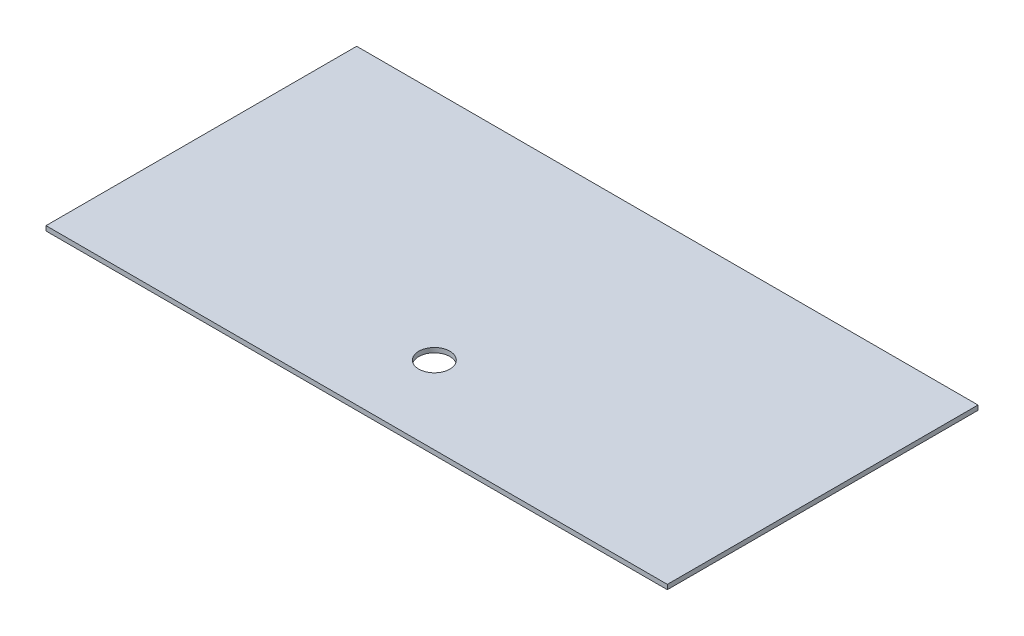
ISO-10303-21;
HEADER;
FILE_DESCRIPTION(('STEP AP214'),'2;1');
FILE_NAME('part.step','',(''),(''),'','','');
FILE_SCHEMA(('AUTOMOTIVE_DESIGN { 1 0 10303 214 1 1 1 1 }'));
ENDSEC;
DATA;
#1=APPLICATION_CONTEXT('core data for automotive mechanical design processes');
#2=APPLICATION_PROTOCOL_DEFINITION('international standard','automotive_design',2000,#1);
#3=PRODUCT_CONTEXT('',#1,'mechanical');
#4=PRODUCT('Part','Part','',(#3));
#5=PRODUCT_RELATED_PRODUCT_CATEGORY('part','',(#4));
#6=PRODUCT_DEFINITION_FORMATION('','',#4);
#7=PRODUCT_DEFINITION_CONTEXT('part definition',#1,'design');
#8=PRODUCT_DEFINITION('design','',#6,#7);
#9=PRODUCT_DEFINITION_SHAPE('','',#8);
#10=(LENGTH_UNIT() NAMED_UNIT(*) SI_UNIT(.MILLI.,.METRE.));
#11=(NAMED_UNIT(*) PLANE_ANGLE_UNIT() SI_UNIT($,.RADIAN.));
#12=(NAMED_UNIT(*) SI_UNIT($,.STERADIAN.) SOLID_ANGLE_UNIT());
#13=UNCERTAINTY_MEASURE_WITH_UNIT(LENGTH_MEASURE(1.E-05),#10,'distance_accuracy_value','');
#14=(GEOMETRIC_REPRESENTATION_CONTEXT(3) GLOBAL_UNCERTAINTY_ASSIGNED_CONTEXT((#13)) GLOBAL_UNIT_ASSIGNED_CONTEXT((#10,
#11,#12)) REPRESENTATION_CONTEXT('',''));
#15=CARTESIAN_POINT('',(0.,0.,0.));
#16=DIRECTION('',(0.,0.,1.));
#17=DIRECTION('',(1.,0.,0.));
#18=AXIS2_PLACEMENT_3D('',#15,#16,#17);
#19=CARTESIAN_POINT('',(0.,18.,0.));
#20=DIRECTION('',(0.,-1.,0.));
#21=DIRECTION('',(0.,0.,-1.));
#22=AXIS2_PLACEMENT_3D('',#19,#20,#21);
#23=PLANE('',#22);
#24=DIRECTION('',(0.,0.,-1.));
#25=VECTOR('',#24,1.);
#26=CARTESIAN_POINT('',(1200.,18.,600.));
#27=LINE('',#26,#25);
#28=CARTESIAN_POINT('',(1200.,18.,600.));
#29=VERTEX_POINT('',#28);
#30=CARTESIAN_POINT('',(1200.,18.,-600.));
#31=VERTEX_POINT('',#30);
#32=EDGE_CURVE('E91',#29,#31,#27,.T.);
#33=ORIENTED_EDGE('',*,*,#32,.T.);
#34=DIRECTION('',(-1.,0.,0.));
#35=VECTOR('',#34,1.);
#36=CARTESIAN_POINT('',(-1200.,18.,-600.));
#37=LINE('',#36,#35);
#38=CARTESIAN_POINT('',(-1200.,18.,-600.));
#39=VERTEX_POINT('',#38);
#40=EDGE_CURVE('E86',#31,#39,#37,.T.);
#41=ORIENTED_EDGE('',*,*,#40,.T.);
#42=DIRECTION('',(0.,0.,1.));
#43=VECTOR('',#42,1.);
#44=CARTESIAN_POINT('',(-1200.,18.,600.));
#45=LINE('',#44,#43);
#46=CARTESIAN_POINT('',(-1200.,18.,600.));
#47=VERTEX_POINT('',#46);
#48=EDGE_CURVE('E89',#39,#47,#45,.T.);
#49=ORIENTED_EDGE('',*,*,#48,.T.);
#50=DIRECTION('',(1.,0.,0.));
#51=VECTOR('',#50,1.);
#52=CARTESIAN_POINT('',(-1200.,18.,600.));
#53=LINE('',#52,#51);
#54=EDGE_CURVE('E56',#47,#29,#53,.T.);
#55=ORIENTED_EDGE('',*,*,#54,.T.);
#56=EDGE_LOOP('',(#33,#41,#49,#55));
#57=FACE_BOUND('',#56,.T.);
#58=CARTESIAN_POINT('',(0.,18.,300.));
#59=DIRECTION('',(0.,1.,0.));
#60=DIRECTION('',(0.,0.,1.));
#61=AXIS2_PLACEMENT_3D('',#58,#59,#60);
#62=CIRCLE('',#61,60.);
#63=CARTESIAN_POINT('',(0.,18.,360.));
#64=VERTEX_POINT('',#63);
#65=EDGE_CURVE('E106',#64,#64,#62,.T.);
#66=ORIENTED_EDGE('',*,*,#65,.F.);
#67=EDGE_LOOP('',(#66));
#68=FACE_BOUND('',#67,.T.);
#69=ADVANCED_FACE('F39',(#57,#68),#23,.F.);
#70=CARTESIAN_POINT('',(0.,0.,0.));
#71=DIRECTION('',(0.,-1.,0.));
#72=DIRECTION('',(0.,0.,-1.));
#73=AXIS2_PLACEMENT_3D('',#70,#71,#72);
#74=PLANE('',#73);
#75=DIRECTION('',(0.,0.,-1.));
#76=VECTOR('',#75,1.);
#77=CARTESIAN_POINT('',(1200.,0.,600.));
#78=LINE('',#77,#76);
#79=CARTESIAN_POINT('',(1200.,0.,600.));
#80=VERTEX_POINT('',#79);
#81=CARTESIAN_POINT('',(1200.,0.,-600.));
#82=VERTEX_POINT('',#81);
#83=EDGE_CURVE('E103',#80,#82,#78,.T.);
#84=ORIENTED_EDGE('',*,*,#83,.F.);
#85=DIRECTION('',(1.,0.,0.));
#86=VECTOR('',#85,1.);
#87=CARTESIAN_POINT('',(-1200.,0.,600.));
#88=LINE('',#87,#86);
#89=CARTESIAN_POINT('',(-1200.,0.,600.));
#90=VERTEX_POINT('',#89);
#91=EDGE_CURVE('E79',#90,#80,#88,.T.);
#92=ORIENTED_EDGE('',*,*,#91,.F.);
#93=DIRECTION('',(0.,0.,1.));
#94=VECTOR('',#93,1.);
#95=CARTESIAN_POINT('',(-1200.,0.,600.));
#96=LINE('',#95,#94);
#97=CARTESIAN_POINT('',(-1200.,0.,-600.));
#98=VERTEX_POINT('',#97);
#99=EDGE_CURVE('E73',#98,#90,#96,.T.);
#100=ORIENTED_EDGE('',*,*,#99,.F.);
#101=DIRECTION('',(-1.,0.,0.));
#102=VECTOR('',#101,1.);
#103=CARTESIAN_POINT('',(-1200.,0.,-600.));
#104=LINE('',#103,#102);
#105=EDGE_CURVE('E95',#82,#98,#104,.T.);
#106=ORIENTED_EDGE('',*,*,#105,.F.);
#107=EDGE_LOOP('',(#84,#92,#100,#106));
#108=FACE_BOUND('',#107,.T.);
#109=CARTESIAN_POINT('',(0.,0.,300.));
#110=DIRECTION('',(0.,1.,0.));
#111=DIRECTION('',(0.,0.,1.));
#112=AXIS2_PLACEMENT_3D('',#109,#110,#111);
#113=CIRCLE('',#112,60.);
#114=CARTESIAN_POINT('',(0.,0.,360.));
#115=VERTEX_POINT('',#114);
#116=EDGE_CURVE('E118',#115,#115,#113,.T.);
#117=ORIENTED_EDGE('',*,*,#116,.T.);
#118=EDGE_LOOP('',(#117));
#119=FACE_BOUND('',#118,.T.);
#120=ADVANCED_FACE('F114',(#108,#119),#74,.T.);
#121=CARTESIAN_POINT('',(1200.,18.,600.));
#122=DIRECTION('',(-1.,0.,0.));
#123=DIRECTION('',(0.,0.,1.));
#124=AXIS2_PLACEMENT_3D('',#121,#122,#123);
#125=PLANE('',#124);
#126=ORIENTED_EDGE('',*,*,#83,.T.);
#127=DIRECTION('',(0.,-1.,0.));
#128=VECTOR('',#127,1.);
#129=CARTESIAN_POINT('',(1200.,18.,-600.));
#130=LINE('',#129,#128);
#131=EDGE_CURVE('E11',#31,#82,#130,.T.);
#132=ORIENTED_EDGE('',*,*,#131,.F.);
#133=ORIENTED_EDGE('',*,*,#32,.F.);
#134=DIRECTION('',(0.,-1.,0.));
#135=VECTOR('',#134,1.);
#136=CARTESIAN_POINT('',(1200.,18.,600.));
#137=LINE('',#136,#135);
#138=EDGE_CURVE('E99',#29,#80,#137,.T.);
#139=ORIENTED_EDGE('',*,*,#138,.T.);
#140=EDGE_LOOP('',(#126,#132,#133,#139));
#141=FACE_BOUND('',#140,.T.);
#142=ADVANCED_FACE('F41',(#141),#125,.F.);
#143=CARTESIAN_POINT('',(-1200.,18.,-600.));
#144=DIRECTION('',(0.,0.,1.));
#145=DIRECTION('',(1.,0.,0.));
#146=AXIS2_PLACEMENT_3D('',#143,#144,#145);
#147=PLANE('',#146);
#148=ORIENTED_EDGE('',*,*,#105,.T.);
#149=DIRECTION('',(0.,-1.,0.));
#150=VECTOR('',#149,1.);
#151=CARTESIAN_POINT('',(-1200.,18.,-600.));
#152=LINE('',#151,#150);
#153=EDGE_CURVE('E48',#39,#98,#152,.T.);
#154=ORIENTED_EDGE('',*,*,#153,.F.);
#155=ORIENTED_EDGE('',*,*,#40,.F.);
#156=ORIENTED_EDGE('',*,*,#131,.T.);
#157=EDGE_LOOP('',(#148,#154,#155,#156));
#158=FACE_BOUND('',#157,.T.);
#159=ADVANCED_FACE('F94',(#158),#147,.F.);
#160=CARTESIAN_POINT('',(-1200.,18.,600.));
#161=DIRECTION('',(1.,0.,0.));
#162=DIRECTION('',(0.,0.,-1.));
#163=AXIS2_PLACEMENT_3D('',#160,#161,#162);
#164=PLANE('',#163);
#165=ORIENTED_EDGE('',*,*,#99,.T.);
#166=DIRECTION('',(0.,-1.,0.));
#167=VECTOR('',#166,1.);
#168=CARTESIAN_POINT('',(-1200.,18.,600.));
#169=LINE('',#168,#167);
#170=EDGE_CURVE('E96',#47,#90,#169,.T.);
#171=ORIENTED_EDGE('',*,*,#170,.F.);
#172=ORIENTED_EDGE('',*,*,#48,.F.);
#173=ORIENTED_EDGE('',*,*,#153,.T.);
#174=EDGE_LOOP('',(#165,#171,#172,#173));
#175=FACE_BOUND('',#174,.T.);
#176=ADVANCED_FACE('F97',(#175),#164,.F.);
#177=CARTESIAN_POINT('',(-1200.,18.,600.));
#178=DIRECTION('',(0.,0.,-1.));
#179=DIRECTION('',(-1.,0.,0.));
#180=AXIS2_PLACEMENT_3D('',#177,#178,#179);
#181=PLANE('',#180);
#182=ORIENTED_EDGE('',*,*,#91,.T.);
#183=ORIENTED_EDGE('',*,*,#138,.F.);
#184=ORIENTED_EDGE('',*,*,#54,.F.);
#185=ORIENTED_EDGE('',*,*,#170,.T.);
#186=EDGE_LOOP('',(#182,#183,#184,#185));
#187=FACE_BOUND('',#186,.T.);
#188=ADVANCED_FACE('F111',(#187),#181,.F.);
#189=CARTESIAN_POINT('',(0.,18.,300.));
#190=DIRECTION('',(0.,-1.,0.));
#191=DIRECTION('',(0.,0.,-1.));
#192=AXIS2_PLACEMENT_3D('',#189,#190,#191);
#193=CYLINDRICAL_SURFACE('',#192,60.);
#194=ORIENTED_EDGE('',*,*,#65,.T.);
#195=EDGE_LOOP('',(#194));
#196=FACE_BOUND('',#195,.T.);
#197=ORIENTED_EDGE('',*,*,#116,.F.);
#198=EDGE_LOOP('',(#197));
#199=FACE_BOUND('',#198,.T.);
#200=ADVANCED_FACE('F124',(#196,#199),#193,.F.);
#201=CLOSED_SHELL('',(#69,#120,#142,#159,#176,#188,#200));
#202=MANIFOLD_SOLID_BREP('B2',#201);
#203=ADVANCED_BREP_SHAPE_REPRESENTATION('',(#18,#202),#14);
#204=SHAPE_DEFINITION_REPRESENTATION(#9,#203);
ENDSEC;
END-ISO-10303-21;
